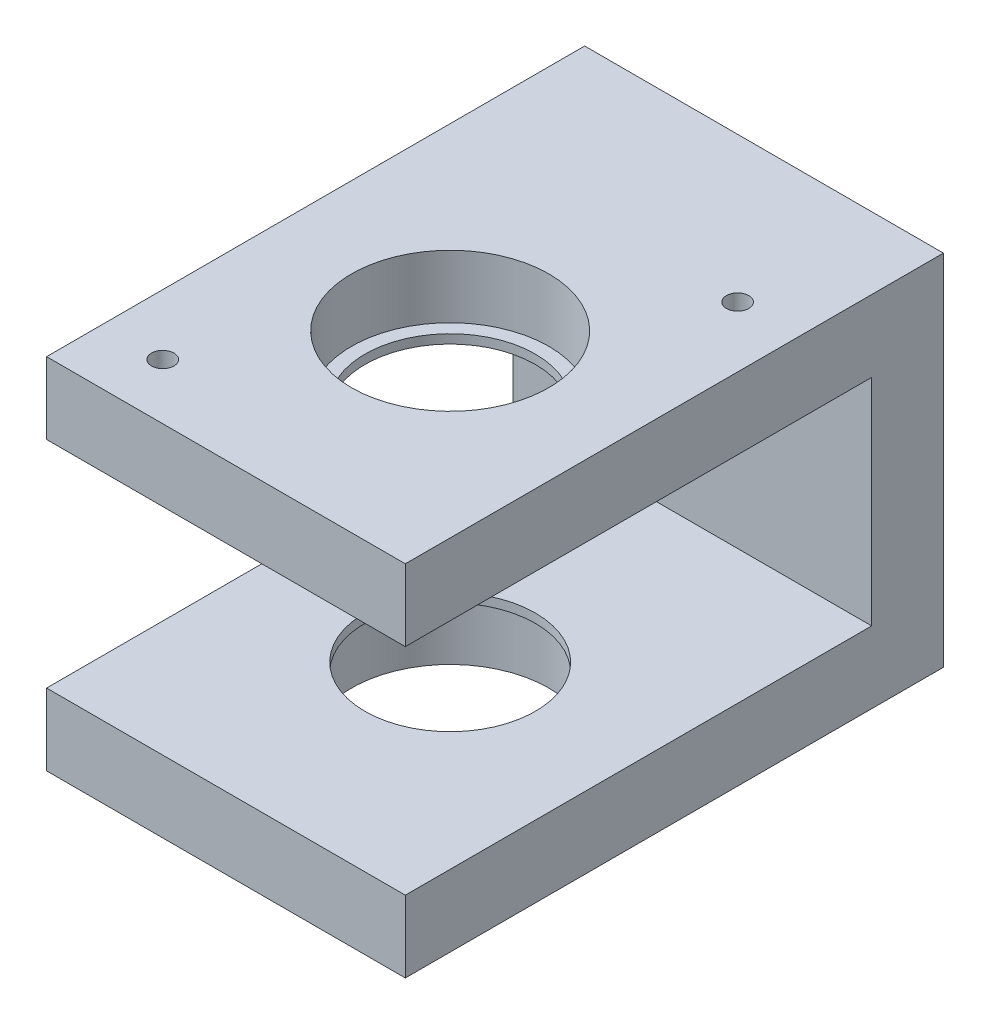
ISO-10303-21;
HEADER;
FILE_DESCRIPTION(('STEP AP214'),'2;1');
FILE_NAME('part.step','',(''),(''),'','','');
FILE_SCHEMA(('AUTOMOTIVE_DESIGN { 1 0 10303 214 1 1 1 1 }'));
ENDSEC;
DATA;
#1=APPLICATION_CONTEXT('core data for automotive mechanical design processes');
#2=APPLICATION_PROTOCOL_DEFINITION('international standard','automotive_design',2000,#1);
#3=PRODUCT_CONTEXT('',#1,'mechanical');
#4=PRODUCT('Part','Part','',(#3));
#5=PRODUCT_RELATED_PRODUCT_CATEGORY('part','',(#4));
#6=PRODUCT_DEFINITION_FORMATION('','',#4);
#7=PRODUCT_DEFINITION_CONTEXT('part definition',#1,'design');
#8=PRODUCT_DEFINITION('design','',#6,#7);
#9=PRODUCT_DEFINITION_SHAPE('','',#8);
#10=(LENGTH_UNIT() NAMED_UNIT(*) SI_UNIT(.MILLI.,.METRE.));
#11=(NAMED_UNIT(*) PLANE_ANGLE_UNIT() SI_UNIT($,.RADIAN.));
#12=(NAMED_UNIT(*) SI_UNIT($,.STERADIAN.) SOLID_ANGLE_UNIT());
#13=UNCERTAINTY_MEASURE_WITH_UNIT(LENGTH_MEASURE(1.E-05),#10,'distance_accuracy_value','');
#14=(GEOMETRIC_REPRESENTATION_CONTEXT(3) GLOBAL_UNCERTAINTY_ASSIGNED_CONTEXT((#13)) GLOBAL_UNIT_ASSIGNED_CONTEXT((#10,
#11,#12)) REPRESENTATION_CONTEXT('',''));
#15=CARTESIAN_POINT('',(0.,0.,0.));
#16=DIRECTION('',(0.,0.,1.));
#17=DIRECTION('',(1.,0.,0.));
#18=AXIS2_PLACEMENT_3D('',#15,#16,#17);
#19=CARTESIAN_POINT('',(0.,0.,60.));
#20=DIRECTION('',(0.,0.,1.));
#21=DIRECTION('',(1.,0.,0.));
#22=AXIS2_PLACEMENT_3D('',#19,#20,#21);
#23=PLANE('',#22);
#24=DIRECTION('',(1.,0.,0.));
#25=VECTOR('',#24,1.);
#26=CARTESIAN_POINT('',(0.,32.,60.));
#27=LINE('',#26,#25);
#28=CARTESIAN_POINT('',(0.,32.,60.));
#29=VERTEX_POINT('',#28);
#30=CARTESIAN_POINT('',(40.,32.,60.));
#31=VERTEX_POINT('',#30);
#32=EDGE_CURVE('E106',#29,#31,#27,.T.);
#33=ORIENTED_EDGE('',*,*,#32,.T.);
#34=DIRECTION('',(0.,1.,0.));
#35=VECTOR('',#34,1.);
#36=CARTESIAN_POINT('',(40.,0.,60.));
#37=LINE('',#36,#35);
#38=CARTESIAN_POINT('',(40.,40.,60.));
#39=VERTEX_POINT('',#38);
#40=EDGE_CURVE('E130',#31,#39,#37,.T.);
#41=ORIENTED_EDGE('',*,*,#40,.T.);
#42=DIRECTION('',(1.,0.,0.));
#43=VECTOR('',#42,1.);
#44=CARTESIAN_POINT('',(0.,40.,60.));
#45=LINE('',#44,#43);
#46=CARTESIAN_POINT('',(0.,40.,60.));
#47=VERTEX_POINT('',#46);
#48=EDGE_CURVE('E125',#47,#39,#45,.T.);
#49=ORIENTED_EDGE('',*,*,#48,.F.);
#50=DIRECTION('',(0.,1.,0.));
#51=VECTOR('',#50,1.);
#52=CARTESIAN_POINT('',(0.,0.,60.));
#53=LINE('',#52,#51);
#54=EDGE_CURVE('E118',#29,#47,#53,.T.);
#55=ORIENTED_EDGE('',*,*,#54,.F.);
#56=EDGE_LOOP('',(#33,#41,#49,#55));
#57=FACE_BOUND('',#56,.T.);
#58=ADVANCED_FACE('F32',(#57),#23,.T.);
#59=CARTESIAN_POINT('',(40.,0.,0.));
#60=DIRECTION('',(0.,0.,-1.));
#61=DIRECTION('',(-1.,0.,0.));
#62=AXIS2_PLACEMENT_3D('',#59,#60,#61);
#63=PLANE('',#62);
#64=CARTESIAN_POINT('',(10.,20.,0.));
#65=DIRECTION('',(0.,0.,-1.));
#66=DIRECTION('',(-1.,0.,0.));
#67=AXIS2_PLACEMENT_3D('',#64,#65,#66);
#68=CIRCLE('',#67,1.);
#69=CARTESIAN_POINT('',(9.,20.,0.));
#70=VERTEX_POINT('',#69);
#71=EDGE_CURVE('E211',#70,#70,#68,.F.);
#72=ORIENTED_EDGE('',*,*,#71,.T.);
#73=EDGE_LOOP('',(#72));
#74=FACE_BOUND('',#73,.T.);
#75=CARTESIAN_POINT('',(20.,20.,0.));
#76=DIRECTION('',(0.,0.,1.));
#77=DIRECTION('',(1.,0.,0.));
#78=AXIS2_PLACEMENT_3D('',#75,#76,#77);
#79=CIRCLE('',#78,2.25);
#80=CARTESIAN_POINT('',(22.25,20.,0.));
#81=VERTEX_POINT('',#80);
#82=EDGE_CURVE('E169',#81,#81,#79,.T.);
#83=ORIENTED_EDGE('',*,*,#82,.T.);
#84=EDGE_LOOP('',(#83));
#85=FACE_BOUND('',#84,.T.);
#86=DIRECTION('',(-1.,0.,0.));
#87=VECTOR('',#86,1.);
#88=CARTESIAN_POINT('',(40.,40.,0.));
#89=LINE('',#88,#87);
#90=CARTESIAN_POINT('',(40.,40.,0.));
#91=VERTEX_POINT('',#90);
#92=CARTESIAN_POINT('',(0.,40.,0.));
#93=VERTEX_POINT('',#92);
#94=EDGE_CURVE('E148',#91,#93,#89,.T.);
#95=ORIENTED_EDGE('',*,*,#94,.F.);
#96=DIRECTION('',(0.,1.,0.));
#97=VECTOR('',#96,1.);
#98=CARTESIAN_POINT('',(40.,0.,0.));
#99=LINE('',#98,#97);
#100=CARTESIAN_POINT('',(40.,0.,0.));
#101=VERTEX_POINT('',#100);
#102=EDGE_CURVE('E56',#101,#91,#99,.T.);
#103=ORIENTED_EDGE('',*,*,#102,.F.);
#104=DIRECTION('',(-1.,0.,0.));
#105=VECTOR('',#104,1.);
#106=CARTESIAN_POINT('',(40.,0.,0.));
#107=LINE('',#106,#105);
#108=CARTESIAN_POINT('',(0.,0.,0.));
#109=VERTEX_POINT('',#108);
#110=EDGE_CURVE('E144',#101,#109,#107,.T.);
#111=ORIENTED_EDGE('',*,*,#110,.T.);
#112=DIRECTION('',(0.,1.,0.));
#113=VECTOR('',#112,1.);
#114=CARTESIAN_POINT('',(0.,0.,0.));
#115=LINE('',#114,#113);
#116=EDGE_CURVE('E82',#109,#93,#115,.T.);
#117=ORIENTED_EDGE('',*,*,#116,.T.);
#118=EDGE_LOOP('',(#95,#103,#111,#117));
#119=FACE_BOUND('',#118,.T.);
#120=ADVANCED_FACE('F230',(#74,#85,#119),#63,.T.);
#121=CARTESIAN_POINT('',(40.,0.,60.));
#122=DIRECTION('',(1.,0.,0.));
#123=DIRECTION('',(0.,0.,-1.));
#124=AXIS2_PLACEMENT_3D('',#121,#122,#123);
#125=PLANE('',#124);
#126=DIRECTION('',(0.,0.,1.));
#127=VECTOR('',#126,1.);
#128=CARTESIAN_POINT('',(40.,32.,8.));
#129=LINE('',#128,#127);
#130=CARTESIAN_POINT('',(40.,32.,8.));
#131=VERTEX_POINT('',#130);
#132=EDGE_CURVE('E111',#131,#31,#129,.T.);
#133=ORIENTED_EDGE('',*,*,#132,.F.);
#134=DIRECTION('',(0.,1.,0.));
#135=VECTOR('',#134,1.);
#136=CARTESIAN_POINT('',(40.,8.,8.));
#137=LINE('',#136,#135);
#138=CARTESIAN_POINT('',(40.,8.,8.));
#139=VERTEX_POINT('',#138);
#140=EDGE_CURVE('E122',#139,#131,#137,.T.);
#141=ORIENTED_EDGE('',*,*,#140,.F.);
#142=DIRECTION('',(0.,0.,-1.));
#143=VECTOR('',#142,1.);
#144=CARTESIAN_POINT('',(40.,8.,60.));
#145=LINE('',#144,#143);
#146=CARTESIAN_POINT('',(40.,8.,60.));
#147=VERTEX_POINT('',#146);
#148=EDGE_CURVE('E165',#147,#139,#145,.T.);
#149=ORIENTED_EDGE('',*,*,#148,.F.);
#150=CARTESIAN_POINT('',(40.,0.,60.));
#151=VERTEX_POINT('',#150);
#152=EDGE_CURVE('E134',#151,#147,#37,.T.);
#153=ORIENTED_EDGE('',*,*,#152,.F.);
#154=DIRECTION('',(0.,0.,-1.));
#155=VECTOR('',#154,1.);
#156=CARTESIAN_POINT('',(40.,0.,60.));
#157=LINE('',#156,#155);
#158=EDGE_CURVE('E131',#151,#101,#157,.T.);
#159=ORIENTED_EDGE('',*,*,#158,.T.);
#160=ORIENTED_EDGE('',*,*,#102,.T.);
#161=DIRECTION('',(0.,0.,-1.));
#162=VECTOR('',#161,1.);
#163=CARTESIAN_POINT('',(40.,40.,60.));
#164=LINE('',#163,#162);
#165=EDGE_CURVE('E141',#39,#91,#164,.T.);
#166=ORIENTED_EDGE('',*,*,#165,.F.);
#167=ORIENTED_EDGE('',*,*,#40,.F.);
#168=EDGE_LOOP('',(#133,#141,#149,#153,#159,#160,#166,#167));
#169=FACE_BOUND('',#168,.T.);
#170=ADVANCED_FACE('F227',(#169),#125,.T.);
#171=DIRECTION('',(1.,0.,0.));
#172=VECTOR('',#171,1.);
#173=CARTESIAN_POINT('',(0.,8.,60.));
#174=LINE('',#173,#172);
#175=CARTESIAN_POINT('',(0.,8.,60.));
#176=VERTEX_POINT('',#175);
#177=EDGE_CURVE('E115',#176,#147,#174,.T.);
#178=ORIENTED_EDGE('',*,*,#177,.F.);
#179=CARTESIAN_POINT('',(0.,0.,60.));
#180=VERTEX_POINT('',#179);
#181=EDGE_CURVE('E127',#180,#176,#53,.T.);
#182=ORIENTED_EDGE('',*,*,#181,.F.);
#183=DIRECTION('',(1.,0.,0.));
#184=VECTOR('',#183,1.);
#185=CARTESIAN_POINT('',(0.,0.,60.));
#186=LINE('',#185,#184);
#187=EDGE_CURVE('E153',#180,#151,#186,.T.);
#188=ORIENTED_EDGE('',*,*,#187,.T.);
#189=ORIENTED_EDGE('',*,*,#152,.T.);
#190=EDGE_LOOP('',(#178,#182,#188,#189));
#191=FACE_BOUND('',#190,.T.);
#192=ADVANCED_FACE('F237',(#191),#23,.T.);
#193=CARTESIAN_POINT('',(0.,0.,0.));
#194=DIRECTION('',(-1.,0.,0.));
#195=DIRECTION('',(0.,0.,1.));
#196=AXIS2_PLACEMENT_3D('',#193,#194,#195);
#197=PLANE('',#196);
#198=DIRECTION('',(0.,0.,1.));
#199=VECTOR('',#198,1.);
#200=CARTESIAN_POINT('',(0.,32.,8.));
#201=LINE('',#200,#199);
#202=CARTESIAN_POINT('',(0.,32.,8.));
#203=VERTEX_POINT('',#202);
#204=EDGE_CURVE('E109',#203,#29,#201,.T.);
#205=ORIENTED_EDGE('',*,*,#204,.T.);
#206=ORIENTED_EDGE('',*,*,#54,.T.);
#207=DIRECTION('',(0.,0.,1.));
#208=VECTOR('',#207,1.);
#209=CARTESIAN_POINT('',(0.,40.,0.));
#210=LINE('',#209,#208);
#211=EDGE_CURVE('E146',#93,#47,#210,.T.);
#212=ORIENTED_EDGE('',*,*,#211,.F.);
#213=ORIENTED_EDGE('',*,*,#116,.F.);
#214=DIRECTION('',(0.,0.,1.));
#215=VECTOR('',#214,1.);
#216=CARTESIAN_POINT('',(0.,0.,0.));
#217=LINE('',#216,#215);
#218=EDGE_CURVE('E156',#109,#180,#217,.T.);
#219=ORIENTED_EDGE('',*,*,#218,.T.);
#220=ORIENTED_EDGE('',*,*,#181,.T.);
#221=DIRECTION('',(0.,0.,-1.));
#222=VECTOR('',#221,1.);
#223=CARTESIAN_POINT('',(0.,8.,60.));
#224=LINE('',#223,#222);
#225=CARTESIAN_POINT('',(0.,8.,8.));
#226=VERTEX_POINT('',#225);
#227=EDGE_CURVE('E121',#176,#226,#224,.T.);
#228=ORIENTED_EDGE('',*,*,#227,.T.);
#229=DIRECTION('',(0.,1.,0.));
#230=VECTOR('',#229,1.);
#231=CARTESIAN_POINT('',(0.,8.,8.));
#232=LINE('',#231,#230);
#233=EDGE_CURVE('E47',#226,#203,#232,.T.);
#234=ORIENTED_EDGE('',*,*,#233,.T.);
#235=EDGE_LOOP('',(#205,#206,#212,#213,#219,#220,#228,#234));
#236=FACE_BOUND('',#235,.T.);
#237=ADVANCED_FACE('F117',(#236),#197,.T.);
#238=CARTESIAN_POINT('',(0.,0.,0.));
#239=DIRECTION('',(0.,1.,0.));
#240=DIRECTION('',(0.,0.,1.));
#241=AXIS2_PLACEMENT_3D('',#238,#239,#240);
#242=PLANE('',#241);
#243=CARTESIAN_POINT('',(20.,0.,35.));
#244=DIRECTION('',(0.,-1.,0.));
#245=DIRECTION('',(0.,0.,-1.));
#246=AXIS2_PLACEMENT_3D('',#243,#244,#245);
#247=CIRCLE('',#246,11.);
#248=CARTESIAN_POINT('',(20.,0.,24.));
#249=VERTEX_POINT('',#248);
#250=EDGE_CURVE('E183',#249,#249,#247,.T.);
#251=ORIENTED_EDGE('',*,*,#250,.F.);
#252=EDGE_LOOP('',(#251));
#253=FACE_BOUND('',#252,.T.);
#254=ORIENTED_EDGE('',*,*,#110,.F.);
#255=ORIENTED_EDGE('',*,*,#158,.F.);
#256=ORIENTED_EDGE('',*,*,#187,.F.);
#257=ORIENTED_EDGE('',*,*,#218,.F.);
#258=EDGE_LOOP('',(#254,#255,#256,#257));
#259=FACE_BOUND('',#258,.T.);
#260=ADVANCED_FACE('F233',(#253,#259),#242,.F.);
#261=CARTESIAN_POINT('',(0.,40.,0.));
#262=DIRECTION('',(0.,1.,0.));
#263=DIRECTION('',(0.,0.,1.));
#264=AXIS2_PLACEMENT_3D('',#261,#262,#263);
#265=PLANE('',#264);
#266=CARTESIAN_POINT('',(33.24990566,40.,16.2));
#267=DIRECTION('',(0.,1.,0.));
#268=DIRECTION('',(0.,0.,1.));
#269=AXIS2_PLACEMENT_3D('',#266,#267,#268);
#270=CIRCLE('',#269,1.24999999999999);
#271=CARTESIAN_POINT('',(33.24990566,40.,17.45));
#272=VERTEX_POINT('',#271);
#273=EDGE_CURVE('E195',#272,#272,#270,.T.);
#274=ORIENTED_EDGE('',*,*,#273,.F.);
#275=EDGE_LOOP('',(#274));
#276=FACE_BOUND('',#275,.T.);
#277=CARTESIAN_POINT('',(6.75009433996,40.,53.8));
#278=DIRECTION('',(0.,1.,0.));
#279=DIRECTION('',(0.,0.,1.));
#280=AXIS2_PLACEMENT_3D('',#277,#278,#279);
#281=CIRCLE('',#280,1.24999999999999);
#282=CARTESIAN_POINT('',(6.75009433996,40.,55.05));
#283=VERTEX_POINT('',#282);
#284=EDGE_CURVE('E189',#283,#283,#281,.T.);
#285=ORIENTED_EDGE('',*,*,#284,.F.);
#286=EDGE_LOOP('',(#285));
#287=FACE_BOUND('',#286,.T.);
#288=CARTESIAN_POINT('',(20.,40.,35.));
#289=DIRECTION('',(0.,1.,0.));
#290=DIRECTION('',(0.,0.,1.));
#291=AXIS2_PLACEMENT_3D('',#288,#289,#290);
#292=CIRCLE('',#291,11.);
#293=CARTESIAN_POINT('',(20.,40.,46.));
#294=VERTEX_POINT('',#293);
#295=EDGE_CURVE('E177',#294,#294,#292,.T.);
#296=ORIENTED_EDGE('',*,*,#295,.F.);
#297=EDGE_LOOP('',(#296));
#298=FACE_BOUND('',#297,.T.);
#299=ORIENTED_EDGE('',*,*,#94,.T.);
#300=ORIENTED_EDGE('',*,*,#211,.T.);
#301=ORIENTED_EDGE('',*,*,#48,.T.);
#302=ORIENTED_EDGE('',*,*,#165,.T.);
#303=EDGE_LOOP('',(#299,#300,#301,#302));
#304=FACE_BOUND('',#303,.T.);
#305=ADVANCED_FACE('F229',(#276,#287,#298,#304),#265,.T.);
#306=CARTESIAN_POINT('',(0.,32.,8.));
#307=DIRECTION('',(0.,1.,0.));
#308=DIRECTION('',(0.,0.,1.));
#309=AXIS2_PLACEMENT_3D('',#306,#307,#308);
#310=PLANE('',#309);
#311=CARTESIAN_POINT('',(20.,32.,35.));
#312=DIRECTION('',(0.,1.,0.));
#313=DIRECTION('',(0.,0.,1.));
#314=AXIS2_PLACEMENT_3D('',#311,#312,#313);
#315=CIRCLE('',#314,9.49999999999999);
#316=CARTESIAN_POINT('',(20.,32.,44.5));
#317=VERTEX_POINT('',#316);
#318=EDGE_CURVE('E204',#317,#317,#315,.T.);
#319=ORIENTED_EDGE('',*,*,#318,.T.);
#320=EDGE_LOOP('',(#319));
#321=FACE_BOUND('',#320,.T.);
#322=CARTESIAN_POINT('',(33.24990566,32.,16.2));
#323=DIRECTION('',(0.,1.,0.));
#324=DIRECTION('',(0.,0.,1.));
#325=AXIS2_PLACEMENT_3D('',#322,#323,#324);
#326=CIRCLE('',#325,1.24999999999999);
#327=CARTESIAN_POINT('',(33.24990566,32.,17.45));
#328=VERTEX_POINT('',#327);
#329=EDGE_CURVE('E192',#328,#328,#326,.T.);
#330=ORIENTED_EDGE('',*,*,#329,.T.);
#331=EDGE_LOOP('',(#330));
#332=FACE_BOUND('',#331,.T.);
#333=CARTESIAN_POINT('',(6.75009433996,32.,53.8));
#334=DIRECTION('',(0.,1.,0.));
#335=DIRECTION('',(0.,0.,1.));
#336=AXIS2_PLACEMENT_3D('',#333,#334,#335);
#337=CIRCLE('',#336,1.24999999999999);
#338=CARTESIAN_POINT('',(6.75009433996,32.,55.05));
#339=VERTEX_POINT('',#338);
#340=EDGE_CURVE('E186',#339,#339,#337,.T.);
#341=ORIENTED_EDGE('',*,*,#340,.T.);
#342=EDGE_LOOP('',(#341));
#343=FACE_BOUND('',#342,.T.);
#344=ORIENTED_EDGE('',*,*,#132,.T.);
#345=ORIENTED_EDGE('',*,*,#32,.F.);
#346=ORIENTED_EDGE('',*,*,#204,.F.);
#347=DIRECTION('',(1.,0.,0.));
#348=VECTOR('',#347,1.);
#349=CARTESIAN_POINT('',(0.,32.,8.));
#350=LINE('',#349,#348);
#351=EDGE_CURVE('E151',#203,#131,#350,.T.);
#352=ORIENTED_EDGE('',*,*,#351,.T.);
#353=EDGE_LOOP('',(#344,#345,#346,#352));
#354=FACE_BOUND('',#353,.T.);
#355=ADVANCED_FACE('F108',(#321,#332,#343,#354),#310,.F.);
#356=CARTESIAN_POINT('',(0.,8.,8.));
#357=DIRECTION('',(0.,0.,-1.));
#358=DIRECTION('',(-1.,0.,0.));
#359=AXIS2_PLACEMENT_3D('',#356,#357,#358);
#360=PLANE('',#359);
#361=CARTESIAN_POINT('',(10.,20.,8.));
#362=DIRECTION('',(0.,0.,1.));
#363=DIRECTION('',(1.,0.,0.));
#364=AXIS2_PLACEMENT_3D('',#361,#362,#363);
#365=CIRCLE('',#364,1.);
#366=CARTESIAN_POINT('',(11.,20.,8.));
#367=VERTEX_POINT('',#366);
#368=EDGE_CURVE('E210',#367,#367,#365,.T.);
#369=ORIENTED_EDGE('',*,*,#368,.F.);
#370=EDGE_LOOP('',(#369));
#371=FACE_BOUND('',#370,.T.);
#372=CARTESIAN_POINT('',(20.,20.,8.));
#373=DIRECTION('',(0.,0.,-1.));
#374=DIRECTION('',(-1.,0.,0.));
#375=AXIS2_PLACEMENT_3D('',#372,#373,#374);
#376=CIRCLE('',#375,4.25000000000001);
#377=CARTESIAN_POINT('',(15.75,20.,8.));
#378=VERTEX_POINT('',#377);
#379=EDGE_CURVE('E11',#378,#378,#376,.T.);
#380=ORIENTED_EDGE('',*,*,#379,.T.);
#381=EDGE_LOOP('',(#380));
#382=FACE_BOUND('',#381,.T.);
#383=ORIENTED_EDGE('',*,*,#140,.T.);
#384=ORIENTED_EDGE('',*,*,#351,.F.);
#385=ORIENTED_EDGE('',*,*,#233,.F.);
#386=DIRECTION('',(1.,0.,0.));
#387=VECTOR('',#386,1.);
#388=CARTESIAN_POINT('',(0.,8.,8.));
#389=LINE('',#388,#387);
#390=EDGE_CURVE('E160',#226,#139,#389,.T.);
#391=ORIENTED_EDGE('',*,*,#390,.T.);
#392=EDGE_LOOP('',(#383,#384,#385,#391));
#393=FACE_BOUND('',#392,.T.);
#394=ADVANCED_FACE('F219',(#371,#382,#393),#360,.F.);
#395=CARTESIAN_POINT('',(0.,8.,60.));
#396=DIRECTION('',(0.,-1.,0.));
#397=DIRECTION('',(0.,0.,-1.));
#398=AXIS2_PLACEMENT_3D('',#395,#396,#397);
#399=PLANE('',#398);
#400=CARTESIAN_POINT('',(20.,8.,35.));
#401=DIRECTION('',(0.,-1.,0.));
#402=DIRECTION('',(0.,0.,-1.));
#403=AXIS2_PLACEMENT_3D('',#400,#401,#402);
#404=CIRCLE('',#403,9.49999999999999);
#405=CARTESIAN_POINT('',(20.,8.,25.5));
#406=VERTEX_POINT('',#405);
#407=EDGE_CURVE('E198',#406,#406,#404,.T.);
#408=ORIENTED_EDGE('',*,*,#407,.T.);
#409=EDGE_LOOP('',(#408));
#410=FACE_BOUND('',#409,.T.);
#411=ORIENTED_EDGE('',*,*,#148,.T.);
#412=ORIENTED_EDGE('',*,*,#390,.F.);
#413=ORIENTED_EDGE('',*,*,#227,.F.);
#414=ORIENTED_EDGE('',*,*,#177,.T.);
#415=EDGE_LOOP('',(#411,#412,#413,#414));
#416=FACE_BOUND('',#415,.T.);
#417=ADVANCED_FACE('F222',(#410,#416),#399,.F.);
#418=CARTESIAN_POINT('',(20.,20.,8.));
#419=DIRECTION('',(0.,0.,1.));
#420=DIRECTION('',(1.,0.,0.));
#421=AXIS2_PLACEMENT_3D('',#418,#419,#420);
#422=CYLINDRICAL_SURFACE('',#421,2.25);
#423=CARTESIAN_POINT('',(20.,20.,5.99999999999902));
#424=DIRECTION('',(0.,0.,-1.));
#425=DIRECTION('',(-1.,0.,0.));
#426=AXIS2_PLACEMENT_3D('',#423,#424,#425);
#427=CIRCLE('',#426,2.25);
#428=CARTESIAN_POINT('',(17.75,20.,5.99999999999902));
#429=VERTEX_POINT('',#428);
#430=EDGE_CURVE('E40',#429,#429,#427,.F.);
#431=ORIENTED_EDGE('',*,*,#430,.T.);
#432=EDGE_LOOP('',(#431));
#433=FACE_BOUND('',#432,.T.);
#434=ORIENTED_EDGE('',*,*,#82,.F.);
#435=EDGE_LOOP('',(#434));
#436=FACE_BOUND('',#435,.T.);
#437=ADVANCED_FACE('F240',(#433,#436),#422,.F.);
#438=CARTESIAN_POINT('',(20.,33.,35.));
#439=DIRECTION('',(0.,-1.,0.));
#440=DIRECTION('',(0.,0.,-1.));
#441=AXIS2_PLACEMENT_3D('',#438,#439,#440);
#442=PLANE('',#441);
#443=CARTESIAN_POINT('',(20.,33.,35.));
#444=DIRECTION('',(0.,-1.,0.));
#445=DIRECTION('',(0.,0.,-1.));
#446=AXIS2_PLACEMENT_3D('',#443,#444,#445);
#447=CIRCLE('',#446,9.49999999999999);
#448=CARTESIAN_POINT('',(20.,33.,25.5));
#449=VERTEX_POINT('',#448);
#450=EDGE_CURVE('E201',#449,#449,#447,.T.);
#451=ORIENTED_EDGE('',*,*,#450,.T.);
#452=EDGE_LOOP('',(#451));
#453=FACE_BOUND('',#452,.T.);
#454=CARTESIAN_POINT('',(20.,33.,35.));
#455=DIRECTION('',(0.,1.,0.));
#456=DIRECTION('',(0.,0.,1.));
#457=AXIS2_PLACEMENT_3D('',#454,#455,#456);
#458=CIRCLE('',#457,11.);
#459=CARTESIAN_POINT('',(20.,33.,46.));
#460=VERTEX_POINT('',#459);
#461=EDGE_CURVE('E174',#460,#460,#458,.T.);
#462=ORIENTED_EDGE('',*,*,#461,.T.);
#463=EDGE_LOOP('',(#462));
#464=FACE_BOUND('',#463,.T.);
#465=ADVANCED_FACE('F246',(#453,#464),#442,.F.);
#466=CARTESIAN_POINT('',(20.,40.,35.));
#467=DIRECTION('',(0.,1.,0.));
#468=DIRECTION('',(0.,0.,1.));
#469=AXIS2_PLACEMENT_3D('',#466,#467,#468);
#470=CYLINDRICAL_SURFACE('',#469,11.);
#471=ORIENTED_EDGE('',*,*,#461,.F.);
#472=EDGE_LOOP('',(#471));
#473=FACE_BOUND('',#472,.T.);
#474=ORIENTED_EDGE('',*,*,#295,.T.);
#475=EDGE_LOOP('',(#474));
#476=FACE_BOUND('',#475,.T.);
#477=ADVANCED_FACE('F291',(#473,#476),#470,.F.);
#478=CARTESIAN_POINT('',(20.,7.,35.));
#479=DIRECTION('',(0.,1.,0.));
#480=DIRECTION('',(0.,0.,1.));
#481=AXIS2_PLACEMENT_3D('',#478,#479,#480);
#482=PLANE('',#481);
#483=CARTESIAN_POINT('',(20.,7.,35.));
#484=DIRECTION('',(0.,-1.,0.));
#485=DIRECTION('',(0.,0.,-1.));
#486=AXIS2_PLACEMENT_3D('',#483,#484,#485);
#487=CIRCLE('',#486,9.49999999999999);
#488=CARTESIAN_POINT('',(20.,7.,25.5));
#489=VERTEX_POINT('',#488);
#490=EDGE_CURVE('E207',#489,#489,#487,.T.);
#491=ORIENTED_EDGE('',*,*,#490,.F.);
#492=EDGE_LOOP('',(#491));
#493=FACE_BOUND('',#492,.T.);
#494=CARTESIAN_POINT('',(20.,7.,35.));
#495=DIRECTION('',(0.,-1.,0.));
#496=DIRECTION('',(0.,0.,-1.));
#497=AXIS2_PLACEMENT_3D('',#494,#495,#496);
#498=CIRCLE('',#497,11.);
#499=CARTESIAN_POINT('',(20.,7.,24.));
#500=VERTEX_POINT('',#499);
#501=EDGE_CURVE('E180',#500,#500,#498,.T.);
#502=ORIENTED_EDGE('',*,*,#501,.T.);
#503=EDGE_LOOP('',(#502));
#504=FACE_BOUND('',#503,.T.);
#505=ADVANCED_FACE('F293',(#493,#504),#482,.F.);
#506=CARTESIAN_POINT('',(20.,0.,35.));
#507=DIRECTION('',(0.,-1.,0.));
#508=DIRECTION('',(0.,0.,-1.));
#509=AXIS2_PLACEMENT_3D('',#506,#507,#508);
#510=CYLINDRICAL_SURFACE('',#509,11.);
#511=ORIENTED_EDGE('',*,*,#501,.F.);
#512=EDGE_LOOP('',(#511));
#513=FACE_BOUND('',#512,.T.);
#514=ORIENTED_EDGE('',*,*,#250,.T.);
#515=EDGE_LOOP('',(#514));
#516=FACE_BOUND('',#515,.T.);
#517=ADVANCED_FACE('F284',(#513,#516),#510,.F.);
#518=CARTESIAN_POINT('',(6.75009433996,40.,53.8));
#519=DIRECTION('',(0.,1.,0.));
#520=DIRECTION('',(0.,0.,1.));
#521=AXIS2_PLACEMENT_3D('',#518,#519,#520);
#522=CYLINDRICAL_SURFACE('',#521,1.24999999999999);
#523=ORIENTED_EDGE('',*,*,#340,.F.);
#524=EDGE_LOOP('',(#523));
#525=FACE_BOUND('',#524,.T.);
#526=ORIENTED_EDGE('',*,*,#284,.T.);
#527=EDGE_LOOP('',(#526));
#528=FACE_BOUND('',#527,.T.);
#529=ADVANCED_FACE('F280',(#525,#528),#522,.F.);
#530=CARTESIAN_POINT('',(33.24990566,40.,16.2));
#531=DIRECTION('',(0.,1.,0.));
#532=DIRECTION('',(0.,0.,1.));
#533=AXIS2_PLACEMENT_3D('',#530,#531,#532);
#534=CYLINDRICAL_SURFACE('',#533,1.24999999999999);
#535=ORIENTED_EDGE('',*,*,#329,.F.);
#536=EDGE_LOOP('',(#535));
#537=FACE_BOUND('',#536,.T.);
#538=ORIENTED_EDGE('',*,*,#273,.T.);
#539=EDGE_LOOP('',(#538));
#540=FACE_BOUND('',#539,.T.);
#541=ADVANCED_FACE('F283',(#537,#540),#534,.F.);
#542=CARTESIAN_POINT('',(20.,20.,5.99999999999902));
#543=DIRECTION('',(0.,0.,1.));
#544=DIRECTION('',(1.,0.,0.));
#545=AXIS2_PLACEMENT_3D('',#542,#543,#544);
#546=CONICAL_SURFACE('',#545,2.25,0.785398163397208);
#547=ORIENTED_EDGE('',*,*,#379,.F.);
#548=EDGE_LOOP('',(#547));
#549=FACE_BOUND('',#548,.T.);
#550=ORIENTED_EDGE('',*,*,#430,.F.);
#551=EDGE_LOOP('',(#550));
#552=FACE_BOUND('',#551,.T.);
#553=ADVANCED_FACE('F34',(#549,#552),#546,.F.);
#554=CARTESIAN_POINT('',(20.,7.,35.));
#555=DIRECTION('',(0.,-1.,0.));
#556=DIRECTION('',(0.,0.,-1.));
#557=AXIS2_PLACEMENT_3D('',#554,#555,#556);
#558=CYLINDRICAL_SURFACE('',#557,9.49999999999999);
#559=ORIENTED_EDGE('',*,*,#490,.T.);
#560=EDGE_LOOP('',(#559));
#561=FACE_BOUND('',#560,.T.);
#562=ORIENTED_EDGE('',*,*,#407,.F.);
#563=EDGE_LOOP('',(#562));
#564=FACE_BOUND('',#563,.T.);
#565=ADVANCED_FACE('F312',(#561,#564),#558,.F.);
#566=ORIENTED_EDGE('',*,*,#318,.F.);
#567=EDGE_LOOP('',(#566));
#568=FACE_BOUND('',#567,.T.);
#569=ORIENTED_EDGE('',*,*,#450,.F.);
#570=EDGE_LOOP('',(#569));
#571=FACE_BOUND('',#570,.T.);
#572=ADVANCED_FACE('F315',(#568,#571),#558,.F.);
#573=CARTESIAN_POINT('',(10.,20.,-0.000999999999999265));
#574=DIRECTION('',(0.,0.,1.));
#575=DIRECTION('',(1.,0.,0.));
#576=AXIS2_PLACEMENT_3D('',#573,#574,#575);
#577=CYLINDRICAL_SURFACE('',#576,1.);
#578=ORIENTED_EDGE('',*,*,#71,.F.);
#579=EDGE_LOOP('',(#578));
#580=FACE_BOUND('',#579,.T.);
#581=ORIENTED_EDGE('',*,*,#368,.T.);
#582=EDGE_LOOP('',(#581));
#583=FACE_BOUND('',#582,.T.);
#584=ADVANCED_FACE('F217',(#580,#583),#577,.F.);
#585=CLOSED_SHELL('',(#58,#120,#170,#192,#237,#260,#305,#355,#394,#417,#437,#465,#477,#505,#517,
#529,#541,#553,#565,#572,#584));
#586=MANIFOLD_SOLID_BREP('B2',#585);
#587=ADVANCED_BREP_SHAPE_REPRESENTATION('',(#18,#586),#14);
#588=SHAPE_DEFINITION_REPRESENTATION(#9,#587);
ENDSEC;
END-ISO-10303-21;
